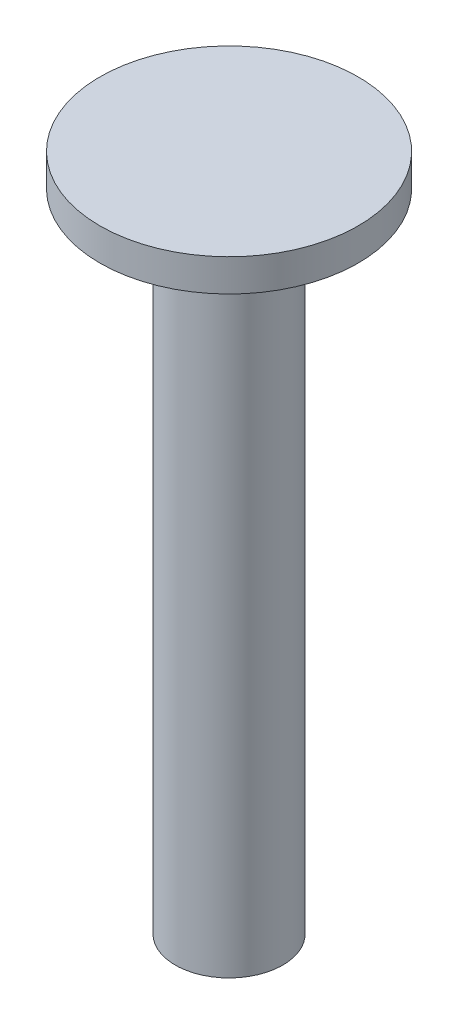
ISO-10303-21;
HEADER;
FILE_DESCRIPTION(('STEP AP214'),'2;1');
FILE_NAME('part.step','',(''),(''),'','','');
FILE_SCHEMA(('AUTOMOTIVE_DESIGN { 1 0 10303 214 1 1 1 1 }'));
ENDSEC;
DATA;
#1=APPLICATION_CONTEXT('core data for automotive mechanical design processes');
#2=APPLICATION_PROTOCOL_DEFINITION('international standard','automotive_design',2000,#1);
#3=PRODUCT_CONTEXT('',#1,'mechanical');
#4=PRODUCT('Part','Part','',(#3));
#5=PRODUCT_RELATED_PRODUCT_CATEGORY('part','',(#4));
#6=PRODUCT_DEFINITION_FORMATION('','',#4);
#7=PRODUCT_DEFINITION_CONTEXT('part definition',#1,'design');
#8=PRODUCT_DEFINITION('design','',#6,#7);
#9=PRODUCT_DEFINITION_SHAPE('','',#8);
#10=(LENGTH_UNIT() NAMED_UNIT(*) SI_UNIT(.MILLI.,.METRE.));
#11=(NAMED_UNIT(*) PLANE_ANGLE_UNIT() SI_UNIT($,.RADIAN.));
#12=(NAMED_UNIT(*) SI_UNIT($,.STERADIAN.) SOLID_ANGLE_UNIT());
#13=UNCERTAINTY_MEASURE_WITH_UNIT(LENGTH_MEASURE(1.E-05),#10,'distance_accuracy_value','');
#14=(GEOMETRIC_REPRESENTATION_CONTEXT(3) GLOBAL_UNCERTAINTY_ASSIGNED_CONTEXT((#13)) GLOBAL_UNIT_ASSIGNED_CONTEXT((#10,
#11,#12)) REPRESENTATION_CONTEXT('',''));
#15=CARTESIAN_POINT('',(0.,0.,0.));
#16=DIRECTION('',(0.,0.,1.));
#17=DIRECTION('',(1.,0.,0.));
#18=AXIS2_PLACEMENT_3D('',#15,#16,#17);
#19=CARTESIAN_POINT('',(0.,0.6,0.));
#20=DIRECTION('',(0.,-1.,0.));
#21=DIRECTION('',(0.,0.,-1.));
#22=AXIS2_PLACEMENT_3D('',#19,#20,#21);
#23=CYLINDRICAL_SURFACE('',#22,2.4);
#24=CARTESIAN_POINT('',(0.,0.6,0.));
#25=DIRECTION('',(0.,1.,0.));
#26=DIRECTION('',(0.,0.,1.));
#27=AXIS2_PLACEMENT_3D('',#24,#25,#26);
#28=CIRCLE('',#27,2.4);
#29=CARTESIAN_POINT('',(0.,0.6,2.4));
#30=VERTEX_POINT('',#29);
#31=EDGE_CURVE('E46',#30,#30,#28,.T.);
#32=ORIENTED_EDGE('',*,*,#31,.F.);
#33=EDGE_LOOP('',(#32));
#34=FACE_BOUND('',#33,.T.);
#35=CARTESIAN_POINT('',(0.,0.,0.));
#36=DIRECTION('',(0.,1.,0.));
#37=DIRECTION('',(0.,0.,1.));
#38=AXIS2_PLACEMENT_3D('',#35,#36,#37);
#39=CIRCLE('',#38,2.4);
#40=CARTESIAN_POINT('',(0.,0.,2.4));
#41=VERTEX_POINT('',#40);
#42=EDGE_CURVE('E42',#41,#41,#39,.T.);
#43=ORIENTED_EDGE('',*,*,#42,.T.);
#44=EDGE_LOOP('',(#43));
#45=FACE_BOUND('',#44,.T.);
#46=ADVANCED_FACE('F39',(#34,#45),#23,.T.);
#47=CARTESIAN_POINT('',(0.,0.6,0.));
#48=DIRECTION('',(0.,1.,0.));
#49=DIRECTION('',(0.,0.,1.));
#50=AXIS2_PLACEMENT_3D('',#47,#48,#49);
#51=PLANE('',#50);
#52=ORIENTED_EDGE('',*,*,#31,.T.);
#53=EDGE_LOOP('',(#52));
#54=FACE_BOUND('',#53,.T.);
#55=ADVANCED_FACE('F63',(#54),#51,.T.);
#56=CARTESIAN_POINT('',(0.,0.,0.));
#57=DIRECTION('',(0.,1.,0.));
#58=DIRECTION('',(0.,0.,1.));
#59=AXIS2_PLACEMENT_3D('',#56,#57,#58);
#60=PLANE('',#59);
#61=CARTESIAN_POINT('',(0.,0.,0.));
#62=DIRECTION('',(0.,-1.,0.));
#63=DIRECTION('',(0.,0.,-1.));
#64=AXIS2_PLACEMENT_3D('',#61,#62,#63);
#65=CIRCLE('',#64,1.);
#66=CARTESIAN_POINT('',(0.,0.,-1.));
#67=VERTEX_POINT('',#66);
#68=EDGE_CURVE('E10',#67,#67,#65,.T.);
#69=ORIENTED_EDGE('',*,*,#68,.F.);
#70=EDGE_LOOP('',(#69));
#71=FACE_BOUND('',#70,.T.);
#72=ORIENTED_EDGE('',*,*,#42,.F.);
#73=EDGE_LOOP('',(#72));
#74=FACE_BOUND('',#73,.T.);
#75=ADVANCED_FACE('F60',(#71,#74),#60,.F.);
#76=CARTESIAN_POINT('',(0.,-12.,0.));
#77=DIRECTION('',(0.,1.,0.));
#78=DIRECTION('',(0.,0.,1.));
#79=AXIS2_PLACEMENT_3D('',#76,#77,#78);
#80=CYLINDRICAL_SURFACE('',#79,1.);
#81=CARTESIAN_POINT('',(0.,-12.,0.));
#82=DIRECTION('',(0.,-1.,0.));
#83=DIRECTION('',(0.,0.,-1.));
#84=AXIS2_PLACEMENT_3D('',#81,#82,#83);
#85=CIRCLE('',#84,1.);
#86=CARTESIAN_POINT('',(0.,-12.,-1.));
#87=VERTEX_POINT('',#86);
#88=EDGE_CURVE('E52',#87,#87,#85,.T.);
#89=ORIENTED_EDGE('',*,*,#88,.F.);
#90=EDGE_LOOP('',(#89));
#91=FACE_BOUND('',#90,.T.);
#92=ORIENTED_EDGE('',*,*,#68,.T.);
#93=EDGE_LOOP('',(#92));
#94=FACE_BOUND('',#93,.T.);
#95=ADVANCED_FACE('F62',(#91,#94),#80,.T.);
#96=CARTESIAN_POINT('',(0.,-12.,0.));
#97=DIRECTION('',(0.,-1.,0.));
#98=DIRECTION('',(0.,0.,-1.));
#99=AXIS2_PLACEMENT_3D('',#96,#97,#98);
#100=PLANE('',#99);
#101=ORIENTED_EDGE('',*,*,#88,.T.);
#102=EDGE_LOOP('',(#101));
#103=FACE_BOUND('',#102,.T.);
#104=ADVANCED_FACE('F69',(#103),#100,.T.);
#105=CLOSED_SHELL('',(#46,#55,#75,#95,#104));
#106=MANIFOLD_SOLID_BREP('B2',#105);
#107=ADVANCED_BREP_SHAPE_REPRESENTATION('',(#18,#106),#14);
#108=SHAPE_DEFINITION_REPRESENTATION(#9,#107);
ENDSEC;
END-ISO-10303-21;
